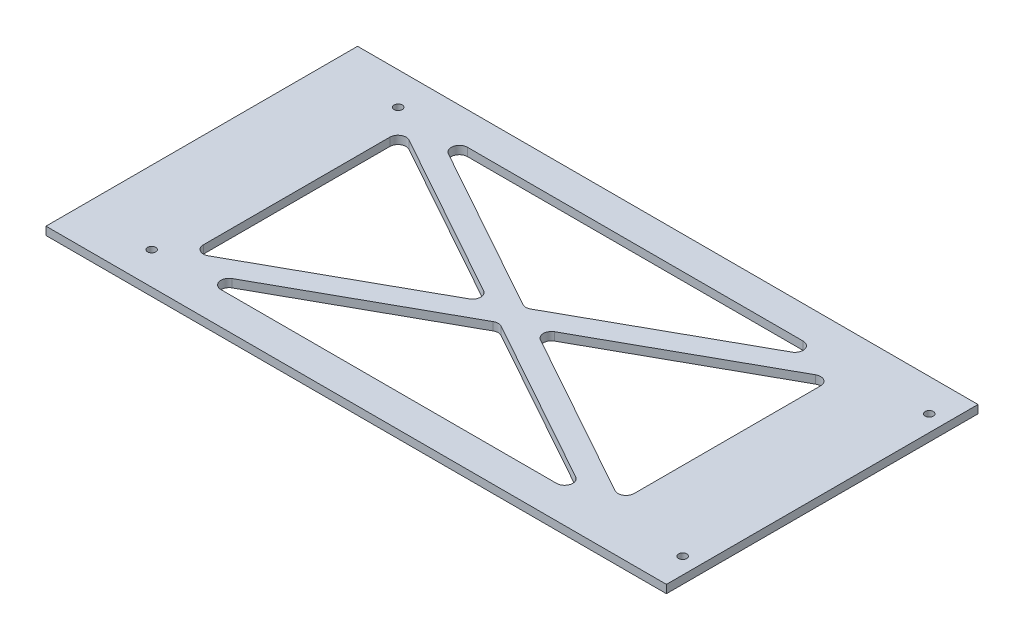
ISO-10303-21;
HEADER;
FILE_DESCRIPTION(('STEP AP214'),'2;1');
FILE_NAME('part.step','',(''),(''),'','','');
FILE_SCHEMA(('AUTOMOTIVE_DESIGN { 1 0 10303 214 1 1 1 1 }'));
ENDSEC;
DATA;
#1=APPLICATION_CONTEXT('core data for automotive mechanical design processes');
#2=APPLICATION_PROTOCOL_DEFINITION('international standard','automotive_design',2000,#1);
#3=PRODUCT_CONTEXT('',#1,'mechanical');
#4=PRODUCT('Part','Part','',(#3));
#5=PRODUCT_RELATED_PRODUCT_CATEGORY('part','',(#4));
#6=PRODUCT_DEFINITION_FORMATION('','',#4);
#7=PRODUCT_DEFINITION_CONTEXT('part definition',#1,'design');
#8=PRODUCT_DEFINITION('design','',#6,#7);
#9=PRODUCT_DEFINITION_SHAPE('','',#8);
#10=(LENGTH_UNIT() NAMED_UNIT(*) SI_UNIT(.MILLI.,.METRE.));
#11=(NAMED_UNIT(*) PLANE_ANGLE_UNIT() SI_UNIT($,.RADIAN.));
#12=(NAMED_UNIT(*) SI_UNIT($,.STERADIAN.) SOLID_ANGLE_UNIT());
#13=UNCERTAINTY_MEASURE_WITH_UNIT(LENGTH_MEASURE(1.E-05),#10,'distance_accuracy_value','');
#14=(GEOMETRIC_REPRESENTATION_CONTEXT(3) GLOBAL_UNCERTAINTY_ASSIGNED_CONTEXT((#13)) GLOBAL_UNIT_ASSIGNED_CONTEXT((#10,
#11,#12)) REPRESENTATION_CONTEXT('',''));
#15=CARTESIAN_POINT('',(0.,0.,0.));
#16=DIRECTION('',(0.,0.,1.));
#17=DIRECTION('',(1.,0.,0.));
#18=AXIS2_PLACEMENT_3D('',#15,#16,#17);
#19=CARTESIAN_POINT('',(0.,3.,0.));
#20=DIRECTION('',(0.,1.,0.));
#21=DIRECTION('',(0.,0.,1.));
#22=AXIS2_PLACEMENT_3D('',#19,#20,#21);
#23=PLANE('',#22);
#24=CARTESIAN_POINT('',(221.789756229659,3.,-23.3016412504768));
#25=DIRECTION('',(0.,1.,0.));
#26=DIRECTION('',(0.,0.,1.));
#27=AXIS2_PLACEMENT_3D('',#24,#25,#26);
#28=CIRCLE('',#27,1.50000000036683);
#29=CARTESIAN_POINT('',(221.789756229659,3.,-21.80164125011));
#30=VERTEX_POINT('',#29);
#31=EDGE_CURVE('E491',#30,#30,#28,.T.);
#32=ORIENTED_EDGE('',*,*,#31,.F.);
#33=EDGE_LOOP('',(#32));
#34=FACE_BOUND('',#33,.T.);
#35=CARTESIAN_POINT('',(25.7897562296587,3.,-23.3016412504768));
#36=DIRECTION('',(0.,1.,0.));
#37=DIRECTION('',(0.,0.,1.));
#38=AXIS2_PLACEMENT_3D('',#35,#36,#37);
#39=CIRCLE('',#38,1.50000000036683);
#40=CARTESIAN_POINT('',(25.7897562296587,3.,-21.80164125011));
#41=VERTEX_POINT('',#40);
#42=EDGE_CURVE('E507',#41,#41,#39,.T.);
#43=ORIENTED_EDGE('',*,*,#42,.F.);
#44=EDGE_LOOP('',(#43));
#45=FACE_BOUND('',#44,.T.);
#46=DIRECTION('',(0.,0.,1.));
#47=VECTOR('',#46,1.);
#48=CARTESIAN_POINT('',(-1.21024377034129,3.,-35.3016412504768));
#49=LINE('',#48,#47);
#50=CARTESIAN_POINT('',(-1.21024377034129,3.,-35.3016412504768));
#51=VERTEX_POINT('',#50);
#52=CARTESIAN_POINT('',(-1.21024377034129,3.,79.6983587495232));
#53=VERTEX_POINT('',#52);
#54=EDGE_CURVE('E515',#51,#53,#49,.T.);
#55=ORIENTED_EDGE('',*,*,#54,.T.);
#56=DIRECTION('',(1.,0.,0.));
#57=VECTOR('',#56,1.);
#58=CARTESIAN_POINT('',(-1.21024377034129,3.,79.6983587495232));
#59=LINE('',#58,#57);
#60=CARTESIAN_POINT('',(227.789756229659,3.,79.6983587495232));
#61=VERTEX_POINT('',#60);
#62=EDGE_CURVE('E519',#53,#61,#59,.T.);
#63=ORIENTED_EDGE('',*,*,#62,.T.);
#64=DIRECTION('',(0.,0.,-1.));
#65=VECTOR('',#64,1.);
#66=CARTESIAN_POINT('',(227.789756229659,3.,-35.3016412504768));
#67=LINE('',#66,#65);
#68=CARTESIAN_POINT('',(227.789756229659,3.,-35.3016412504768));
#69=VERTEX_POINT('',#68);
#70=EDGE_CURVE('E523',#61,#69,#67,.T.);
#71=ORIENTED_EDGE('',*,*,#70,.T.);
#72=DIRECTION('',(-1.,0.,0.));
#73=VECTOR('',#72,1.);
#74=CARTESIAN_POINT('',(-1.21024377034129,3.,-35.3016412504768));
#75=LINE('',#74,#73);
#76=EDGE_CURVE('E526',#69,#51,#75,.T.);
#77=ORIENTED_EDGE('',*,*,#76,.T.);
#78=EDGE_LOOP('',(#55,#63,#71,#77));
#79=FACE_BOUND('',#78,.T.);
#80=CARTESIAN_POINT('',(25.7897562296587,3.,67.6983587495232));
#81=DIRECTION('',(0.,1.,0.));
#82=DIRECTION('',(0.,0.,1.));
#83=AXIS2_PLACEMENT_3D('',#80,#81,#82);
#84=CIRCLE('',#83,1.50000000036683);
#85=CARTESIAN_POINT('',(25.7897562296587,3.,69.19835874989));
#86=VERTEX_POINT('',#85);
#87=EDGE_CURVE('E499',#86,#86,#84,.T.);
#88=ORIENTED_EDGE('',*,*,#87,.F.);
#89=EDGE_LOOP('',(#88));
#90=FACE_BOUND('',#89,.T.);
#91=CARTESIAN_POINT('',(221.789756229659,3.,67.6983587495232));
#92=DIRECTION('',(0.,1.,0.));
#93=DIRECTION('',(0.,0.,1.));
#94=AXIS2_PLACEMENT_3D('',#91,#92,#93);
#95=CIRCLE('',#94,1.50000000036683);
#96=CARTESIAN_POINT('',(221.789756229659,3.,69.19835874989));
#97=VERTEX_POINT('',#96);
#98=EDGE_CURVE('E483',#97,#97,#95,.T.);
#99=ORIENTED_EDGE('',*,*,#98,.F.);
#100=EDGE_LOOP('',(#99));
#101=FACE_BOUND('',#100,.T.);
#102=DIRECTION('',(0.,0.,1.));
#103=VECTOR('',#102,1.);
#104=CARTESIAN_POINT('',(33.7897562296587,3.,-12.2030978701478));
#105=LINE('',#104,#103);
#106=CARTESIAN_POINT('',(33.7897562296587,3.,-12.2030978701478));
#107=VERTEX_POINT('',#106);
#108=CARTESIAN_POINT('',(33.7897562296587,3.,56.5998153691941));
#109=VERTEX_POINT('',#108);
#110=EDGE_CURVE('E423',#107,#109,#105,.T.);
#111=ORIENTED_EDGE('',*,*,#110,.F.);
#112=CARTESIAN_POINT('',(36.7897562296587,3.,-12.2030978701478));
#113=DIRECTION('',(0.,1.,0.));
#114=DIRECTION('',(0.,0.,-1.));
#115=AXIS2_PLACEMENT_3D('',#112,#113,#114);
#116=CIRCLE('',#115,3.);
#117=CARTESIAN_POINT('',(38.2466850231946,3.,-14.8255696985124));
#118=VERTEX_POINT('',#117);
#119=EDGE_CURVE('E420',#118,#107,#116,.T.);
#120=ORIENTED_EDGE('',*,*,#119,.F.);
#121=DIRECTION('',(-0.874157276121538,0.,-0.485642931178632));
#122=VECTOR('',#121,1.);
#123=CARTESIAN_POINT('',(100.169306938602,3.,19.5758869211585));
#124=LINE('',#123,#122);
#125=CARTESIAN_POINT('',(100.169306938602,3.,19.5758869211585));
#126=VERTEX_POINT('',#125);
#127=EDGE_CURVE('E437',#126,#118,#124,.T.);
#128=ORIENTED_EDGE('',*,*,#127,.F.);
#129=CARTESIAN_POINT('',(98.7123781450665,3.,22.1983587495232));
#130=DIRECTION('',(0.,1.,0.));
#131=DIRECTION('',(0.,0.,1.));
#132=AXIS2_PLACEMENT_3D('',#129,#130,#131);
#133=CIRCLE('',#132,3.);
#134=CARTESIAN_POINT('',(100.169306938602,3.,24.8208305778878));
#135=VERTEX_POINT('',#134);
#136=EDGE_CURVE('E433',#135,#126,#133,.T.);
#137=ORIENTED_EDGE('',*,*,#136,.F.);
#138=DIRECTION('',(0.874157276121538,0.,-0.485642931178632));
#139=VECTOR('',#138,1.);
#140=CARTESIAN_POINT('',(38.2466850231946,3.,59.2222871975588));
#141=LINE('',#140,#139);
#142=CARTESIAN_POINT('',(38.2466850231946,3.,59.2222871975588));
#143=VERTEX_POINT('',#142);
#144=EDGE_CURVE('E430',#143,#135,#141,.T.);
#145=ORIENTED_EDGE('',*,*,#144,.F.);
#146=CARTESIAN_POINT('',(36.7897562296587,3.,56.5998153691942));
#147=DIRECTION('',(0.,1.,0.));
#148=DIRECTION('',(0.,0.,-1.));
#149=AXIS2_PLACEMENT_3D('',#146,#147,#148);
#150=CIRCLE('',#149,3.);
#151=EDGE_CURVE('E427',#109,#143,#150,.T.);
#152=ORIENTED_EDGE('',*,*,#151,.F.);
#153=EDGE_LOOP('',(#111,#120,#128,#137,#145,#152));
#154=FACE_BOUND('',#153,.T.);
#155=DIRECTION('',(-0.874157276121538,0.,0.485642931178632));
#156=VECTOR('',#155,1.);
#157=CARTESIAN_POINT('',(49.9102055207152,3.,62.0758869211585));
#158=LINE('',#157,#156);
#159=CARTESIAN_POINT('',(111.832827436123,3.,27.6744303014876));
#160=VERTEX_POINT('',#159);
#161=CARTESIAN_POINT('',(49.9102055207152,3.,62.0758869211585));
#162=VERTEX_POINT('',#161);
#163=EDGE_CURVE('E360',#160,#162,#158,.T.);
#164=ORIENTED_EDGE('',*,*,#163,.F.);
#165=CARTESIAN_POINT('',(113.289756229659,3.,30.2969021298522));
#166=DIRECTION('',(0.,1.,0.));
#167=DIRECTION('',(0.,0.,-1.));
#168=AXIS2_PLACEMENT_3D('',#165,#166,#167);
#169=CIRCLE('',#168,3.);
#170=CARTESIAN_POINT('',(114.746685023195,3.,27.6744303014876));
#171=VERTEX_POINT('',#170);
#172=EDGE_CURVE('E357',#171,#160,#169,.T.);
#173=ORIENTED_EDGE('',*,*,#172,.F.);
#174=DIRECTION('',(-0.874157276121538,0.,-0.485642931178632));
#175=VECTOR('',#174,1.);
#176=CARTESIAN_POINT('',(114.746685023195,3.,27.6744303014876));
#177=LINE('',#176,#175);
#178=CARTESIAN_POINT('',(176.669306938602,3.,62.0758869211585));
#179=VERTEX_POINT('',#178);
#180=EDGE_CURVE('E374',#179,#171,#177,.T.);
#181=ORIENTED_EDGE('',*,*,#180,.F.);
#182=CARTESIAN_POINT('',(175.212378145067,3.,64.6983587495232));
#183=DIRECTION('',(0.,1.,0.));
#184=DIRECTION('',(0.,0.,1.));
#185=AXIS2_PLACEMENT_3D('',#182,#183,#184);
#186=CIRCLE('',#185,3.);
#187=CARTESIAN_POINT('',(175.212378145066,3.,67.6983587495232));
#188=VERTEX_POINT('',#187);
#189=EDGE_CURVE('E370',#188,#179,#186,.T.);
#190=ORIENTED_EDGE('',*,*,#189,.F.);
#191=DIRECTION('',(1.,0.,0.));
#192=VECTOR('',#191,1.);
#193=CARTESIAN_POINT('',(175.212378145066,3.,67.6983587495232));
#194=LINE('',#193,#192);
#195=CARTESIAN_POINT('',(51.3671343142511,3.,67.6983587495232));
#196=VERTEX_POINT('',#195);
#197=EDGE_CURVE('E367',#196,#188,#194,.T.);
#198=ORIENTED_EDGE('',*,*,#197,.F.);
#199=CARTESIAN_POINT('',(51.3671343142509,3.,64.6983587495232));
#200=DIRECTION('',(0.,1.,0.));
#201=DIRECTION('',(0.,0.,-1.));
#202=AXIS2_PLACEMENT_3D('',#199,#200,#201);
#203=CIRCLE('',#202,3.);
#204=EDGE_CURVE('E364',#162,#196,#203,.T.);
#205=ORIENTED_EDGE('',*,*,#204,.F.);
#206=EDGE_LOOP('',(#164,#173,#181,#190,#198,#205));
#207=FACE_BOUND('',#206,.T.);
#208=DIRECTION('',(0.874157276121538,0.,0.485642931178632));
#209=VECTOR('',#208,1.);
#210=CARTESIAN_POINT('',(188.332827436123,3.,59.2222871975587));
#211=LINE('',#210,#209);
#212=CARTESIAN_POINT('',(126.410205520715,3.,24.8208305778878));
#213=VERTEX_POINT('',#212);
#214=CARTESIAN_POINT('',(188.332827436123,3.,59.2222871975587));
#215=VERTEX_POINT('',#214);
#216=EDGE_CURVE('E297',#213,#215,#211,.T.);
#217=ORIENTED_EDGE('',*,*,#216,.F.);
#218=CARTESIAN_POINT('',(127.867134314251,3.,22.1983587495232));
#219=DIRECTION('',(0.,1.,0.));
#220=DIRECTION('',(0.,0.,-1.));
#221=AXIS2_PLACEMENT_3D('',#218,#219,#220);
#222=CIRCLE('',#221,2.99999999999999);
#223=CARTESIAN_POINT('',(126.410205520715,3.,19.5758869211585));
#224=VERTEX_POINT('',#223);
#225=EDGE_CURVE('E294',#224,#213,#222,.T.);
#226=ORIENTED_EDGE('',*,*,#225,.F.);
#227=DIRECTION('',(-0.874157276121538,0.,0.485642931178632));
#228=VECTOR('',#227,1.);
#229=CARTESIAN_POINT('',(126.410205520715,3.,19.5758869211585));
#230=LINE('',#229,#228);
#231=CARTESIAN_POINT('',(188.332827436123,3.,-14.8255696985124));
#232=VERTEX_POINT('',#231);
#233=EDGE_CURVE('E311',#232,#224,#230,.T.);
#234=ORIENTED_EDGE('',*,*,#233,.F.);
#235=CARTESIAN_POINT('',(189.789756229659,3.,-12.2030978701478));
#236=DIRECTION('',(0.,1.,0.));
#237=DIRECTION('',(0.,0.,1.));
#238=AXIS2_PLACEMENT_3D('',#235,#236,#237);
#239=CIRCLE('',#238,3.);
#240=CARTESIAN_POINT('',(192.789756229659,3.,-12.2030978701478));
#241=VERTEX_POINT('',#240);
#242=EDGE_CURVE('E307',#241,#232,#239,.T.);
#243=ORIENTED_EDGE('',*,*,#242,.F.);
#244=DIRECTION('',(0.,0.,-1.));
#245=VECTOR('',#244,1.);
#246=CARTESIAN_POINT('',(192.789756229659,3.,-12.2030978701478));
#247=LINE('',#246,#245);
#248=CARTESIAN_POINT('',(192.789756229659,3.,56.5998153691941));
#249=VERTEX_POINT('',#248);
#250=EDGE_CURVE('E304',#249,#241,#247,.T.);
#251=ORIENTED_EDGE('',*,*,#250,.F.);
#252=CARTESIAN_POINT('',(189.789756229659,3.,56.5998153691942));
#253=DIRECTION('',(0.,1.,0.));
#254=DIRECTION('',(0.,0.,1.));
#255=AXIS2_PLACEMENT_3D('',#252,#253,#254);
#256=CIRCLE('',#255,3.);
#257=EDGE_CURVE('E301',#215,#249,#256,.T.);
#258=ORIENTED_EDGE('',*,*,#257,.F.);
#259=EDGE_LOOP('',(#217,#226,#234,#243,#251,#258));
#260=FACE_BOUND('',#259,.T.);
#261=DIRECTION('',(0.874157276121538,0.,-0.485642931178632));
#262=VECTOR('',#261,1.);
#263=CARTESIAN_POINT('',(114.746685023195,3.,16.7222871975588));
#264=LINE('',#263,#262);
#265=CARTESIAN_POINT('',(114.746685023195,3.,16.7222871975588));
#266=VERTEX_POINT('',#265);
#267=CARTESIAN_POINT('',(176.669306938602,3.,-17.6791694221121));
#268=VERTEX_POINT('',#267);
#269=EDGE_CURVE('E234',#266,#268,#264,.T.);
#270=ORIENTED_EDGE('',*,*,#269,.F.);
#271=CARTESIAN_POINT('',(113.289756229659,3.,14.0998153691942));
#272=DIRECTION('',(0.,1.,0.));
#273=DIRECTION('',(0.,0.,-1.));
#274=AXIS2_PLACEMENT_3D('',#271,#272,#273);
#275=CIRCLE('',#274,3.);
#276=CARTESIAN_POINT('',(111.832827436123,3.,16.7222871975588));
#277=VERTEX_POINT('',#276);
#278=EDGE_CURVE('E225',#277,#266,#275,.T.);
#279=ORIENTED_EDGE('',*,*,#278,.F.);
#280=DIRECTION('',(0.874157276121538,0.,0.485642931178632));
#281=VECTOR('',#280,1.);
#282=CARTESIAN_POINT('',(49.9102055207152,3.,-17.6791694221121));
#283=LINE('',#282,#281);
#284=CARTESIAN_POINT('',(49.9102055207152,3.,-17.6791694221121));
#285=VERTEX_POINT('',#284);
#286=EDGE_CURVE('E260',#285,#277,#283,.T.);
#287=ORIENTED_EDGE('',*,*,#286,.F.);
#288=CARTESIAN_POINT('',(51.3671343142509,3.,-20.3016412504768));
#289=DIRECTION('',(0.,1.,0.));
#290=DIRECTION('',(0.,0.,-1.));
#291=AXIS2_PLACEMENT_3D('',#288,#289,#290);
#292=CIRCLE('',#291,3.);
#293=CARTESIAN_POINT('',(51.3671343142511,3.,-23.3016412504768));
#294=VERTEX_POINT('',#293);
#295=EDGE_CURVE('E257',#294,#285,#292,.T.);
#296=ORIENTED_EDGE('',*,*,#295,.F.);
#297=DIRECTION('',(-1.,0.,0.));
#298=VECTOR('',#297,1.);
#299=CARTESIAN_POINT('',(175.212378145066,3.,-23.3016412504768));
#300=LINE('',#299,#298);
#301=CARTESIAN_POINT('',(175.212378145066,3.,-23.3016412504768));
#302=VERTEX_POINT('',#301);
#303=EDGE_CURVE('E252',#302,#294,#300,.T.);
#304=ORIENTED_EDGE('',*,*,#303,.F.);
#305=CARTESIAN_POINT('',(175.212378145067,3.,-20.3016412504768));
#306=DIRECTION('',(0.,1.,0.));
#307=DIRECTION('',(0.,0.,1.));
#308=AXIS2_PLACEMENT_3D('',#305,#306,#307);
#309=CIRCLE('',#308,3.);
#310=EDGE_CURVE('E248',#268,#302,#309,.T.);
#311=ORIENTED_EDGE('',*,*,#310,.F.);
#312=EDGE_LOOP('',(#270,#279,#287,#296,#304,#311));
#313=FACE_BOUND('',#312,.T.);
#314=ADVANCED_FACE('F39',(#34,#45,#79,#90,#101,#154,#207,#260,#313),#23,.T.);
#315=CARTESIAN_POINT('',(0.,0.,0.));
#316=DIRECTION('',(0.,1.,0.));
#317=DIRECTION('',(0.,0.,1.));
#318=AXIS2_PLACEMENT_3D('',#315,#316,#317);
#319=PLANE('',#318);
#320=CARTESIAN_POINT('',(127.867134314251,0.,22.1983587495232));
#321=DIRECTION('',(0.,1.,0.));
#322=DIRECTION('',(0.,0.,-1.));
#323=AXIS2_PLACEMENT_3D('',#320,#321,#322);
#324=CIRCLE('',#323,2.99999999999999);
#325=CARTESIAN_POINT('',(126.410205520715,0.,19.5758869211585));
#326=VERTEX_POINT('',#325);
#327=CARTESIAN_POINT('',(126.410205520715,0.,24.8208305778878));
#328=VERTEX_POINT('',#327);
#329=EDGE_CURVE('E243',#326,#328,#324,.T.);
#330=ORIENTED_EDGE('',*,*,#329,.T.);
#331=DIRECTION('',(0.874157276121538,0.,0.485642931178632));
#332=VECTOR('',#331,1.);
#333=CARTESIAN_POINT('',(188.332827436123,0.,59.2222871975587));
#334=LINE('',#333,#332);
#335=CARTESIAN_POINT('',(188.332827436123,0.,59.2222871975587));
#336=VERTEX_POINT('',#335);
#337=EDGE_CURVE('E318',#328,#336,#334,.T.);
#338=ORIENTED_EDGE('',*,*,#337,.T.);
#339=CARTESIAN_POINT('',(189.789756229659,0.,56.5998153691942));
#340=DIRECTION('',(0.,1.,0.));
#341=DIRECTION('',(0.,0.,1.));
#342=AXIS2_PLACEMENT_3D('',#339,#340,#341);
#343=CIRCLE('',#342,3.);
#344=CARTESIAN_POINT('',(192.789756229659,0.,56.5998153691941));
#345=VERTEX_POINT('',#344);
#346=EDGE_CURVE('E322',#336,#345,#343,.T.);
#347=ORIENTED_EDGE('',*,*,#346,.T.);
#348=DIRECTION('',(0.,0.,-1.));
#349=VECTOR('',#348,1.);
#350=CARTESIAN_POINT('',(192.789756229659,0.,-12.2030978701478));
#351=LINE('',#350,#349);
#352=CARTESIAN_POINT('',(192.789756229659,0.,-12.2030978701478));
#353=VERTEX_POINT('',#352);
#354=EDGE_CURVE('E326',#345,#353,#351,.T.);
#355=ORIENTED_EDGE('',*,*,#354,.T.);
#356=CARTESIAN_POINT('',(189.789756229659,0.,-12.2030978701478));
#357=DIRECTION('',(0.,1.,0.));
#358=DIRECTION('',(0.,0.,1.));
#359=AXIS2_PLACEMENT_3D('',#356,#357,#358);
#360=CIRCLE('',#359,3.);
#361=CARTESIAN_POINT('',(188.332827436123,0.,-14.8255696985124));
#362=VERTEX_POINT('',#361);
#363=EDGE_CURVE('E330',#353,#362,#360,.T.);
#364=ORIENTED_EDGE('',*,*,#363,.T.);
#365=DIRECTION('',(-0.874157276121538,0.,0.485642931178632));
#366=VECTOR('',#365,1.);
#367=CARTESIAN_POINT('',(126.410205520715,0.,19.5758869211585));
#368=LINE('',#367,#366);
#369=EDGE_CURVE('E298',#362,#326,#368,.T.);
#370=ORIENTED_EDGE('',*,*,#369,.T.);
#371=EDGE_LOOP('',(#330,#338,#347,#355,#364,#370));
#372=FACE_BOUND('',#371,.T.);
#373=CARTESIAN_POINT('',(36.7897562296587,0.,-12.2030978701478));
#374=DIRECTION('',(0.,1.,0.));
#375=DIRECTION('',(0.,0.,-1.));
#376=AXIS2_PLACEMENT_3D('',#373,#374,#375);
#377=CIRCLE('',#376,3.);
#378=CARTESIAN_POINT('',(38.2466850231946,0.,-14.8255696985124));
#379=VERTEX_POINT('',#378);
#380=CARTESIAN_POINT('',(33.7897562296587,0.,-12.2030978701478));
#381=VERTEX_POINT('',#380);
#382=EDGE_CURVE('E419',#379,#381,#377,.T.);
#383=ORIENTED_EDGE('',*,*,#382,.T.);
#384=DIRECTION('',(0.,0.,1.));
#385=VECTOR('',#384,1.);
#386=CARTESIAN_POINT('',(33.7897562296587,0.,-12.2030978701478));
#387=LINE('',#386,#385);
#388=CARTESIAN_POINT('',(33.7897562296587,0.,56.5998153691941));
#389=VERTEX_POINT('',#388);
#390=EDGE_CURVE('E444',#381,#389,#387,.T.);
#391=ORIENTED_EDGE('',*,*,#390,.T.);
#392=CARTESIAN_POINT('',(36.7897562296587,0.,56.5998153691942));
#393=DIRECTION('',(0.,1.,0.));
#394=DIRECTION('',(0.,0.,-1.));
#395=AXIS2_PLACEMENT_3D('',#392,#393,#394);
#396=CIRCLE('',#395,3.);
#397=CARTESIAN_POINT('',(38.2466850231946,0.,59.2222871975588));
#398=VERTEX_POINT('',#397);
#399=EDGE_CURVE('E448',#389,#398,#396,.T.);
#400=ORIENTED_EDGE('',*,*,#399,.T.);
#401=DIRECTION('',(0.874157276121538,0.,-0.485642931178632));
#402=VECTOR('',#401,1.);
#403=CARTESIAN_POINT('',(38.2466850231946,0.,59.2222871975588));
#404=LINE('',#403,#402);
#405=CARTESIAN_POINT('',(100.169306938602,0.,24.8208305778878));
#406=VERTEX_POINT('',#405);
#407=EDGE_CURVE('E452',#398,#406,#404,.T.);
#408=ORIENTED_EDGE('',*,*,#407,.T.);
#409=CARTESIAN_POINT('',(98.7123781450665,0.,22.1983587495232));
#410=DIRECTION('',(0.,1.,0.));
#411=DIRECTION('',(0.,0.,1.));
#412=AXIS2_PLACEMENT_3D('',#409,#410,#411);
#413=CIRCLE('',#412,3.);
#414=CARTESIAN_POINT('',(100.169306938602,0.,19.5758869211585));
#415=VERTEX_POINT('',#414);
#416=EDGE_CURVE('E456',#406,#415,#413,.T.);
#417=ORIENTED_EDGE('',*,*,#416,.T.);
#418=DIRECTION('',(-0.874157276121538,0.,-0.485642931178632));
#419=VECTOR('',#418,1.);
#420=CARTESIAN_POINT('',(100.169306938602,0.,19.5758869211585));
#421=LINE('',#420,#419);
#422=EDGE_CURVE('E424',#415,#379,#421,.T.);
#423=ORIENTED_EDGE('',*,*,#422,.T.);
#424=EDGE_LOOP('',(#383,#391,#400,#408,#417,#423));
#425=FACE_BOUND('',#424,.T.);
#426=DIRECTION('',(0.,0.,1.));
#427=VECTOR('',#426,1.);
#428=CARTESIAN_POINT('',(-1.21024377034129,0.,-35.3016412504768));
#429=LINE('',#428,#427);
#430=CARTESIAN_POINT('',(-1.21024377034129,0.,-35.3016412504768));
#431=VERTEX_POINT('',#430);
#432=CARTESIAN_POINT('',(-1.21024377034129,0.,79.6983587495232));
#433=VERTEX_POINT('',#432);
#434=EDGE_CURVE('E511',#431,#433,#429,.T.);
#435=ORIENTED_EDGE('',*,*,#434,.F.);
#436=DIRECTION('',(-1.,0.,0.));
#437=VECTOR('',#436,1.);
#438=CARTESIAN_POINT('',(-1.21024377034129,0.,-35.3016412504768));
#439=LINE('',#438,#437);
#440=CARTESIAN_POINT('',(227.789756229659,0.,-35.3016412504768));
#441=VERTEX_POINT('',#440);
#442=EDGE_CURVE('E520',#441,#431,#439,.T.);
#443=ORIENTED_EDGE('',*,*,#442,.F.);
#444=DIRECTION('',(0.,0.,-1.));
#445=VECTOR('',#444,1.);
#446=CARTESIAN_POINT('',(227.789756229659,0.,-35.3016412504768));
#447=LINE('',#446,#445);
#448=CARTESIAN_POINT('',(227.789756229659,0.,79.6983587495232));
#449=VERTEX_POINT('',#448);
#450=EDGE_CURVE('E536',#449,#441,#447,.T.);
#451=ORIENTED_EDGE('',*,*,#450,.F.);
#452=DIRECTION('',(1.,0.,0.));
#453=VECTOR('',#452,1.);
#454=CARTESIAN_POINT('',(-1.21024377034129,0.,79.6983587495232));
#455=LINE('',#454,#453);
#456=EDGE_CURVE('E533',#433,#449,#455,.T.);
#457=ORIENTED_EDGE('',*,*,#456,.F.);
#458=EDGE_LOOP('',(#435,#443,#451,#457));
#459=FACE_BOUND('',#458,.T.);
#460=CARTESIAN_POINT('',(25.7897562296587,0.,-23.3016412504768));
#461=DIRECTION('',(0.,1.,0.));
#462=DIRECTION('',(0.,0.,1.));
#463=AXIS2_PLACEMENT_3D('',#460,#461,#462);
#464=CIRCLE('',#463,1.50000000036683);
#465=CARTESIAN_POINT('',(25.7897562296587,0.,-21.80164125011));
#466=VERTEX_POINT('',#465);
#467=EDGE_CURVE('E503',#466,#466,#464,.T.);
#468=ORIENTED_EDGE('',*,*,#467,.T.);
#469=EDGE_LOOP('',(#468));
#470=FACE_BOUND('',#469,.T.);
#471=CARTESIAN_POINT('',(25.7897562296587,0.,67.6983587495232));
#472=DIRECTION('',(0.,1.,0.));
#473=DIRECTION('',(0.,0.,1.));
#474=AXIS2_PLACEMENT_3D('',#471,#472,#473);
#475=CIRCLE('',#474,1.50000000036683);
#476=CARTESIAN_POINT('',(25.7897562296587,0.,69.19835874989));
#477=VERTEX_POINT('',#476);
#478=EDGE_CURVE('E495',#477,#477,#475,.T.);
#479=ORIENTED_EDGE('',*,*,#478,.T.);
#480=EDGE_LOOP('',(#479));
#481=FACE_BOUND('',#480,.T.);
#482=CARTESIAN_POINT('',(221.789756229659,0.,-23.3016412504768));
#483=DIRECTION('',(0.,1.,0.));
#484=DIRECTION('',(0.,0.,1.));
#485=AXIS2_PLACEMENT_3D('',#482,#483,#484);
#486=CIRCLE('',#485,1.50000000036683);
#487=CARTESIAN_POINT('',(221.789756229659,0.,-21.80164125011));
#488=VERTEX_POINT('',#487);
#489=EDGE_CURVE('E487',#488,#488,#486,.T.);
#490=ORIENTED_EDGE('',*,*,#489,.T.);
#491=EDGE_LOOP('',(#490));
#492=FACE_BOUND('',#491,.T.);
#493=CARTESIAN_POINT('',(221.789756229659,0.,67.6983587495232));
#494=DIRECTION('',(0.,1.,0.));
#495=DIRECTION('',(0.,0.,1.));
#496=AXIS2_PLACEMENT_3D('',#493,#494,#495);
#497=CIRCLE('',#496,1.50000000036683);
#498=CARTESIAN_POINT('',(221.789756229659,0.,69.19835874989));
#499=VERTEX_POINT('',#498);
#500=EDGE_CURVE('E482',#499,#499,#497,.T.);
#501=ORIENTED_EDGE('',*,*,#500,.T.);
#502=EDGE_LOOP('',(#501));
#503=FACE_BOUND('',#502,.T.);
#504=CARTESIAN_POINT('',(113.289756229659,0.,30.2969021298522));
#505=DIRECTION('',(0.,1.,0.));
#506=DIRECTION('',(0.,0.,-1.));
#507=AXIS2_PLACEMENT_3D('',#504,#505,#506);
#508=CIRCLE('',#507,3.);
#509=CARTESIAN_POINT('',(114.746685023195,0.,27.6744303014876));
#510=VERTEX_POINT('',#509);
#511=CARTESIAN_POINT('',(111.832827436123,0.,27.6744303014876));
#512=VERTEX_POINT('',#511);
#513=EDGE_CURVE('E356',#510,#512,#508,.T.);
#514=ORIENTED_EDGE('',*,*,#513,.T.);
#515=DIRECTION('',(-0.874157276121538,0.,0.485642931178632));
#516=VECTOR('',#515,1.);
#517=CARTESIAN_POINT('',(49.9102055207152,0.,62.0758869211585));
#518=LINE('',#517,#516);
#519=CARTESIAN_POINT('',(49.9102055207152,0.,62.0758869211585));
#520=VERTEX_POINT('',#519);
#521=EDGE_CURVE('E381',#512,#520,#518,.T.);
#522=ORIENTED_EDGE('',*,*,#521,.T.);
#523=CARTESIAN_POINT('',(51.3671343142509,0.,64.6983587495232));
#524=DIRECTION('',(0.,1.,0.));
#525=DIRECTION('',(0.,0.,-1.));
#526=AXIS2_PLACEMENT_3D('',#523,#524,#525);
#527=CIRCLE('',#526,3.);
#528=CARTESIAN_POINT('',(51.3671343142511,0.,67.6983587495232));
#529=VERTEX_POINT('',#528);
#530=EDGE_CURVE('E385',#520,#529,#527,.T.);
#531=ORIENTED_EDGE('',*,*,#530,.T.);
#532=DIRECTION('',(1.,0.,0.));
#533=VECTOR('',#532,1.);
#534=CARTESIAN_POINT('',(175.212378145066,0.,67.6983587495232));
#535=LINE('',#534,#533);
#536=CARTESIAN_POINT('',(175.212378145066,0.,67.6983587495232));
#537=VERTEX_POINT('',#536);
#538=EDGE_CURVE('E389',#529,#537,#535,.T.);
#539=ORIENTED_EDGE('',*,*,#538,.T.);
#540=CARTESIAN_POINT('',(175.212378145067,0.,64.6983587495232));
#541=DIRECTION('',(0.,1.,0.));
#542=DIRECTION('',(0.,0.,1.));
#543=AXIS2_PLACEMENT_3D('',#540,#541,#542);
#544=CIRCLE('',#543,3.);
#545=CARTESIAN_POINT('',(176.669306938602,0.,62.0758869211585));
#546=VERTEX_POINT('',#545);
#547=EDGE_CURVE('E393',#537,#546,#544,.T.);
#548=ORIENTED_EDGE('',*,*,#547,.T.);
#549=DIRECTION('',(-0.874157276121538,0.,-0.485642931178632));
#550=VECTOR('',#549,1.);
#551=CARTESIAN_POINT('',(114.746685023195,0.,27.6744303014876));
#552=LINE('',#551,#550);
#553=EDGE_CURVE('E361',#546,#510,#552,.T.);
#554=ORIENTED_EDGE('',*,*,#553,.T.);
#555=EDGE_LOOP('',(#514,#522,#531,#539,#548,#554));
#556=FACE_BOUND('',#555,.T.);
#557=CARTESIAN_POINT('',(113.289756229659,0.,14.0998153691942));
#558=DIRECTION('',(0.,1.,0.));
#559=DIRECTION('',(0.,0.,-1.));
#560=AXIS2_PLACEMENT_3D('',#557,#558,#559);
#561=CIRCLE('',#560,3.);
#562=CARTESIAN_POINT('',(111.832827436123,0.,16.7222871975588));
#563=VERTEX_POINT('',#562);
#564=CARTESIAN_POINT('',(114.746685023195,0.,16.7222871975588));
#565=VERTEX_POINT('',#564);
#566=EDGE_CURVE('E63',#563,#565,#561,.T.);
#567=ORIENTED_EDGE('',*,*,#566,.T.);
#568=DIRECTION('',(0.874157276121538,0.,-0.485642931178632));
#569=VECTOR('',#568,1.);
#570=CARTESIAN_POINT('',(114.746685023195,0.,16.7222871975588));
#571=LINE('',#570,#569);
#572=CARTESIAN_POINT('',(176.669306938602,0.,-17.6791694221121));
#573=VERTEX_POINT('',#572);
#574=EDGE_CURVE('E241',#565,#573,#571,.T.);
#575=ORIENTED_EDGE('',*,*,#574,.T.);
#576=CARTESIAN_POINT('',(175.212378145067,0.,-20.3016412504768));
#577=DIRECTION('',(0.,1.,0.));
#578=DIRECTION('',(0.,0.,1.));
#579=AXIS2_PLACEMENT_3D('',#576,#577,#578);
#580=CIRCLE('',#579,3.);
#581=CARTESIAN_POINT('',(175.212378145066,0.,-23.3016412504768));
#582=VERTEX_POINT('',#581);
#583=EDGE_CURVE('E267',#573,#582,#580,.T.);
#584=ORIENTED_EDGE('',*,*,#583,.T.);
#585=DIRECTION('',(-1.,0.,0.));
#586=VECTOR('',#585,1.);
#587=CARTESIAN_POINT('',(175.212378145066,0.,-23.3016412504768));
#588=LINE('',#587,#586);
#589=CARTESIAN_POINT('',(51.3671343142511,0.,-23.3016412504768));
#590=VERTEX_POINT('',#589);
#591=EDGE_CURVE('E271',#582,#590,#588,.T.);
#592=ORIENTED_EDGE('',*,*,#591,.T.);
#593=CARTESIAN_POINT('',(51.3671343142509,0.,-20.3016412504768));
#594=DIRECTION('',(0.,1.,0.));
#595=DIRECTION('',(0.,0.,-1.));
#596=AXIS2_PLACEMENT_3D('',#593,#594,#595);
#597=CIRCLE('',#596,3.);
#598=CARTESIAN_POINT('',(49.9102055207152,0.,-17.6791694221121));
#599=VERTEX_POINT('',#598);
#600=EDGE_CURVE('E275',#590,#599,#597,.T.);
#601=ORIENTED_EDGE('',*,*,#600,.T.);
#602=DIRECTION('',(0.874157276121538,0.,0.485642931178632));
#603=VECTOR('',#602,1.);
#604=CARTESIAN_POINT('',(49.9102055207152,0.,-17.6791694221121));
#605=LINE('',#604,#603);
#606=EDGE_CURVE('E235',#599,#563,#605,.T.);
#607=ORIENTED_EDGE('',*,*,#606,.T.);
#608=EDGE_LOOP('',(#567,#575,#584,#592,#601,#607));
#609=FACE_BOUND('',#608,.T.);
#610=ADVANCED_FACE('F559',(#372,#425,#459,#470,#481,#492,#503,#556,#609),#319,.F.);
#611=CARTESIAN_POINT('',(-1.21024377034129,3.,-35.3016412504768));
#612=DIRECTION('',(1.,0.,0.));
#613=DIRECTION('',(0.,0.,-1.));
#614=AXIS2_PLACEMENT_3D('',#611,#612,#613);
#615=PLANE('',#614);
#616=ORIENTED_EDGE('',*,*,#434,.T.);
#617=DIRECTION('',(0.,-1.,0.));
#618=VECTOR('',#617,1.);
#619=CARTESIAN_POINT('',(-1.21024377034129,3.,79.6983587495232));
#620=LINE('',#619,#618);
#621=EDGE_CURVE('E11',#53,#433,#620,.T.);
#622=ORIENTED_EDGE('',*,*,#621,.F.);
#623=ORIENTED_EDGE('',*,*,#54,.F.);
#624=DIRECTION('',(0.,-1.,0.));
#625=VECTOR('',#624,1.);
#626=CARTESIAN_POINT('',(-1.21024377034129,3.,-35.3016412504768));
#627=LINE('',#626,#625);
#628=EDGE_CURVE('E529',#51,#431,#627,.T.);
#629=ORIENTED_EDGE('',*,*,#628,.T.);
#630=EDGE_LOOP('',(#616,#622,#623,#629));
#631=FACE_BOUND('',#630,.T.);
#632=ADVANCED_FACE('F41',(#631),#615,.F.);
#633=CARTESIAN_POINT('',(-1.21024377034129,3.,79.6983587495232));
#634=DIRECTION('',(0.,0.,-1.));
#635=DIRECTION('',(-1.,0.,0.));
#636=AXIS2_PLACEMENT_3D('',#633,#634,#635);
#637=PLANE('',#636);
#638=ORIENTED_EDGE('',*,*,#456,.T.);
#639=DIRECTION('',(0.,-1.,0.));
#640=VECTOR('',#639,1.);
#641=CARTESIAN_POINT('',(227.789756229659,3.,79.6983587495232));
#642=LINE('',#641,#640);
#643=EDGE_CURVE('E48',#61,#449,#642,.T.);
#644=ORIENTED_EDGE('',*,*,#643,.F.);
#645=ORIENTED_EDGE('',*,*,#62,.F.);
#646=ORIENTED_EDGE('',*,*,#621,.T.);
#647=EDGE_LOOP('',(#638,#644,#645,#646));
#648=FACE_BOUND('',#647,.T.);
#649=ADVANCED_FACE('F570',(#648),#637,.F.);
#650=CARTESIAN_POINT('',(227.789756229659,3.,-35.3016412504768));
#651=DIRECTION('',(-1.,0.,0.));
#652=DIRECTION('',(0.,0.,1.));
#653=AXIS2_PLACEMENT_3D('',#650,#651,#652);
#654=PLANE('',#653);
#655=ORIENTED_EDGE('',*,*,#450,.T.);
#656=DIRECTION('',(0.,-1.,0.));
#657=VECTOR('',#656,1.);
#658=CARTESIAN_POINT('',(227.789756229659,3.,-35.3016412504768));
#659=LINE('',#658,#657);
#660=EDGE_CURVE('E544',#69,#441,#659,.T.);
#661=ORIENTED_EDGE('',*,*,#660,.F.);
#662=ORIENTED_EDGE('',*,*,#70,.F.);
#663=ORIENTED_EDGE('',*,*,#643,.T.);
#664=EDGE_LOOP('',(#655,#661,#662,#663));
#665=FACE_BOUND('',#664,.T.);
#666=ADVANCED_FACE('F553',(#665),#654,.F.);
#667=CARTESIAN_POINT('',(-1.21024377034129,3.,-35.3016412504768));
#668=DIRECTION('',(0.,0.,1.));
#669=DIRECTION('',(1.,0.,0.));
#670=AXIS2_PLACEMENT_3D('',#667,#668,#669);
#671=PLANE('',#670);
#672=ORIENTED_EDGE('',*,*,#442,.T.);
#673=ORIENTED_EDGE('',*,*,#628,.F.);
#674=ORIENTED_EDGE('',*,*,#76,.F.);
#675=ORIENTED_EDGE('',*,*,#660,.T.);
#676=EDGE_LOOP('',(#672,#673,#674,#675));
#677=FACE_BOUND('',#676,.T.);
#678=ADVANCED_FACE('F563',(#677),#671,.F.);
#679=CARTESIAN_POINT('',(25.7897562296587,3.,-23.3016412504768));
#680=DIRECTION('',(0.,-1.,0.));
#681=DIRECTION('',(0.,0.,-1.));
#682=AXIS2_PLACEMENT_3D('',#679,#680,#681);
#683=CYLINDRICAL_SURFACE('',#682,1.50000000036683);
#684=ORIENTED_EDGE('',*,*,#42,.T.);
#685=EDGE_LOOP('',(#684));
#686=FACE_BOUND('',#685,.T.);
#687=ORIENTED_EDGE('',*,*,#467,.F.);
#688=EDGE_LOOP('',(#687));
#689=FACE_BOUND('',#688,.T.);
#690=ADVANCED_FACE('F588',(#686,#689),#683,.F.);
#691=CARTESIAN_POINT('',(25.7897562296587,3.,67.6983587495232));
#692=DIRECTION('',(0.,-1.,0.));
#693=DIRECTION('',(0.,0.,-1.));
#694=AXIS2_PLACEMENT_3D('',#691,#692,#693);
#695=CYLINDRICAL_SURFACE('',#694,1.50000000036683);
#696=ORIENTED_EDGE('',*,*,#87,.T.);
#697=EDGE_LOOP('',(#696));
#698=FACE_BOUND('',#697,.T.);
#699=ORIENTED_EDGE('',*,*,#478,.F.);
#700=EDGE_LOOP('',(#699));
#701=FACE_BOUND('',#700,.T.);
#702=ADVANCED_FACE('F595',(#698,#701),#695,.F.);
#703=CARTESIAN_POINT('',(221.789756229659,3.,-23.3016412504768));
#704=DIRECTION('',(0.,-1.,0.));
#705=DIRECTION('',(0.,0.,-1.));
#706=AXIS2_PLACEMENT_3D('',#703,#704,#705);
#707=CYLINDRICAL_SURFACE('',#706,1.50000000036683);
#708=ORIENTED_EDGE('',*,*,#31,.T.);
#709=EDGE_LOOP('',(#708));
#710=FACE_BOUND('',#709,.T.);
#711=ORIENTED_EDGE('',*,*,#489,.F.);
#712=EDGE_LOOP('',(#711));
#713=FACE_BOUND('',#712,.T.);
#714=ADVANCED_FACE('F600',(#710,#713),#707,.F.);
#715=CARTESIAN_POINT('',(221.789756229659,3.,67.6983587495232));
#716=DIRECTION('',(0.,-1.,0.));
#717=DIRECTION('',(0.,0.,-1.));
#718=AXIS2_PLACEMENT_3D('',#715,#716,#717);
#719=CYLINDRICAL_SURFACE('',#718,1.50000000036683);
#720=ORIENTED_EDGE('',*,*,#98,.T.);
#721=EDGE_LOOP('',(#720));
#722=FACE_BOUND('',#721,.T.);
#723=ORIENTED_EDGE('',*,*,#500,.F.);
#724=EDGE_LOOP('',(#723));
#725=FACE_BOUND('',#724,.T.);
#726=ADVANCED_FACE('F709',(#722,#725),#719,.F.);
#727=CARTESIAN_POINT('',(36.7897562296587,3.,-12.2030978701478));
#728=DIRECTION('',(0.,-1.,0.));
#729=DIRECTION('',(0.,0.,-1.));
#730=AXIS2_PLACEMENT_3D('',#727,#728,#729);
#731=CYLINDRICAL_SURFACE('',#730,3.);
#732=ORIENTED_EDGE('',*,*,#382,.F.);
#733=DIRECTION('',(0.,-1.,0.));
#734=VECTOR('',#733,1.);
#735=CARTESIAN_POINT('',(38.2466850231946,3.,-14.8255696985124));
#736=LINE('',#735,#734);
#737=EDGE_CURVE('E440',#118,#379,#736,.T.);
#738=ORIENTED_EDGE('',*,*,#737,.F.);
#739=ORIENTED_EDGE('',*,*,#119,.T.);
#740=DIRECTION('',(0.,-1.,0.));
#741=VECTOR('',#740,1.);
#742=CARTESIAN_POINT('',(33.7897562296587,3.,-12.2030978701478));
#743=LINE('',#742,#741);
#744=EDGE_CURVE('E478',#107,#381,#743,.T.);
#745=ORIENTED_EDGE('',*,*,#744,.T.);
#746=EDGE_LOOP('',(#732,#738,#739,#745));
#747=FACE_BOUND('',#746,.T.);
#748=ADVANCED_FACE('F705',(#747),#731,.F.);
#749=CARTESIAN_POINT('',(33.7897562296587,3.,-12.2030978701478));
#750=DIRECTION('',(1.,0.,0.));
#751=DIRECTION('',(0.,0.,-1.));
#752=AXIS2_PLACEMENT_3D('',#749,#750,#751);
#753=PLANE('',#752);
#754=ORIENTED_EDGE('',*,*,#390,.F.);
#755=ORIENTED_EDGE('',*,*,#744,.F.);
#756=ORIENTED_EDGE('',*,*,#110,.T.);
#757=DIRECTION('',(0.,-1.,0.));
#758=VECTOR('',#757,1.);
#759=CARTESIAN_POINT('',(33.7897562296587,3.,56.5998153691941));
#760=LINE('',#759,#758);
#761=EDGE_CURVE('E475',#109,#389,#760,.T.);
#762=ORIENTED_EDGE('',*,*,#761,.T.);
#763=EDGE_LOOP('',(#754,#755,#756,#762));
#764=FACE_BOUND('',#763,.T.);
#765=ADVANCED_FACE('F701',(#764),#753,.T.);
#766=CARTESIAN_POINT('',(36.7897562296587,3.,56.5998153691942));
#767=DIRECTION('',(0.,-1.,0.));
#768=DIRECTION('',(0.,0.,-1.));
#769=AXIS2_PLACEMENT_3D('',#766,#767,#768);
#770=CYLINDRICAL_SURFACE('',#769,3.);
#771=ORIENTED_EDGE('',*,*,#399,.F.);
#772=ORIENTED_EDGE('',*,*,#761,.F.);
#773=ORIENTED_EDGE('',*,*,#151,.T.);
#774=DIRECTION('',(0.,-1.,0.));
#775=VECTOR('',#774,1.);
#776=CARTESIAN_POINT('',(38.2466850231946,3.,59.2222871975588));
#777=LINE('',#776,#775);
#778=EDGE_CURVE('E472',#143,#398,#777,.T.);
#779=ORIENTED_EDGE('',*,*,#778,.T.);
#780=EDGE_LOOP('',(#771,#772,#773,#779));
#781=FACE_BOUND('',#780,.T.);
#782=ADVANCED_FACE('F697',(#781),#770,.F.);
#783=CARTESIAN_POINT('',(38.2466850231946,3.,59.2222871975588));
#784=DIRECTION('',(-0.485642931178632,0.,-0.874157276121538));
#785=DIRECTION('',(-0.874157276121538,0.,0.485642931178632));
#786=AXIS2_PLACEMENT_3D('',#783,#784,#785);
#787=PLANE('',#786);
#788=ORIENTED_EDGE('',*,*,#407,.F.);
#789=ORIENTED_EDGE('',*,*,#778,.F.);
#790=ORIENTED_EDGE('',*,*,#144,.T.);
#791=DIRECTION('',(0.,-1.,0.));
#792=VECTOR('',#791,1.);
#793=CARTESIAN_POINT('',(100.169306938602,3.,24.8208305778878));
#794=LINE('',#793,#792);
#795=EDGE_CURVE('E469',#135,#406,#794,.T.);
#796=ORIENTED_EDGE('',*,*,#795,.T.);
#797=EDGE_LOOP('',(#788,#789,#790,#796));
#798=FACE_BOUND('',#797,.T.);
#799=ADVANCED_FACE('F693',(#798),#787,.T.);
#800=CARTESIAN_POINT('',(98.7123781450665,3.,22.1983587495232));
#801=DIRECTION('',(0.,-1.,0.));
#802=DIRECTION('',(0.,0.,-1.));
#803=AXIS2_PLACEMENT_3D('',#800,#801,#802);
#804=CYLINDRICAL_SURFACE('',#803,3.);
#805=ORIENTED_EDGE('',*,*,#416,.F.);
#806=ORIENTED_EDGE('',*,*,#795,.F.);
#807=ORIENTED_EDGE('',*,*,#136,.T.);
#808=DIRECTION('',(0.,-1.,0.));
#809=VECTOR('',#808,1.);
#810=CARTESIAN_POINT('',(100.169306938602,3.,19.5758869211585));
#811=LINE('',#810,#809);
#812=EDGE_CURVE('E466',#126,#415,#811,.T.);
#813=ORIENTED_EDGE('',*,*,#812,.T.);
#814=EDGE_LOOP('',(#805,#806,#807,#813));
#815=FACE_BOUND('',#814,.T.);
#816=ADVANCED_FACE('F689',(#815),#804,.F.);
#817=CARTESIAN_POINT('',(100.169306938602,3.,19.5758869211585));
#818=DIRECTION('',(-0.485642931178632,0.,0.874157276121538));
#819=DIRECTION('',(0.874157276121538,0.,0.485642931178632));
#820=AXIS2_PLACEMENT_3D('',#817,#818,#819);
#821=PLANE('',#820);
#822=ORIENTED_EDGE('',*,*,#422,.F.);
#823=ORIENTED_EDGE('',*,*,#812,.F.);
#824=ORIENTED_EDGE('',*,*,#127,.T.);
#825=ORIENTED_EDGE('',*,*,#737,.T.);
#826=EDGE_LOOP('',(#822,#823,#824,#825));
#827=FACE_BOUND('',#826,.T.);
#828=ADVANCED_FACE('F685',(#827),#821,.T.);
#829=CARTESIAN_POINT('',(113.289756229659,3.,30.2969021298522));
#830=DIRECTION('',(0.,-1.,0.));
#831=DIRECTION('',(0.,0.,-1.));
#832=AXIS2_PLACEMENT_3D('',#829,#830,#831);
#833=CYLINDRICAL_SURFACE('',#832,3.);
#834=ORIENTED_EDGE('',*,*,#513,.F.);
#835=DIRECTION('',(0.,-1.,0.));
#836=VECTOR('',#835,1.);
#837=CARTESIAN_POINT('',(114.746685023195,3.,27.6744303014876));
#838=LINE('',#837,#836);
#839=EDGE_CURVE('E377',#171,#510,#838,.T.);
#840=ORIENTED_EDGE('',*,*,#839,.F.);
#841=ORIENTED_EDGE('',*,*,#172,.T.);
#842=DIRECTION('',(0.,-1.,0.));
#843=VECTOR('',#842,1.);
#844=CARTESIAN_POINT('',(111.832827436123,3.,27.6744303014876));
#845=LINE('',#844,#843);
#846=EDGE_CURVE('E415',#160,#512,#845,.T.);
#847=ORIENTED_EDGE('',*,*,#846,.T.);
#848=EDGE_LOOP('',(#834,#840,#841,#847));
#849=FACE_BOUND('',#848,.T.);
#850=ADVANCED_FACE('F681',(#849),#833,.F.);
#851=CARTESIAN_POINT('',(49.9102055207152,3.,62.0758869211585));
#852=DIRECTION('',(0.485642931178632,0.,0.874157276121538));
#853=DIRECTION('',(0.874157276121538,0.,-0.485642931178632));
#854=AXIS2_PLACEMENT_3D('',#851,#852,#853);
#855=PLANE('',#854);
#856=ORIENTED_EDGE('',*,*,#521,.F.);
#857=ORIENTED_EDGE('',*,*,#846,.F.);
#858=ORIENTED_EDGE('',*,*,#163,.T.);
#859=DIRECTION('',(0.,-1.,0.));
#860=VECTOR('',#859,1.);
#861=CARTESIAN_POINT('',(49.9102055207152,3.,62.0758869211585));
#862=LINE('',#861,#860);
#863=EDGE_CURVE('E412',#162,#520,#862,.T.);
#864=ORIENTED_EDGE('',*,*,#863,.T.);
#865=EDGE_LOOP('',(#856,#857,#858,#864));
#866=FACE_BOUND('',#865,.T.);
#867=ADVANCED_FACE('F677',(#866),#855,.T.);
#868=CARTESIAN_POINT('',(51.3671343142509,3.,64.6983587495232));
#869=DIRECTION('',(0.,-1.,0.));
#870=DIRECTION('',(0.,0.,-1.));
#871=AXIS2_PLACEMENT_3D('',#868,#869,#870);
#872=CYLINDRICAL_SURFACE('',#871,3.);
#873=ORIENTED_EDGE('',*,*,#530,.F.);
#874=ORIENTED_EDGE('',*,*,#863,.F.);
#875=ORIENTED_EDGE('',*,*,#204,.T.);
#876=DIRECTION('',(0.,-1.,0.));
#877=VECTOR('',#876,1.);
#878=CARTESIAN_POINT('',(51.3671343142511,3.,67.6983587495232));
#879=LINE('',#878,#877);
#880=EDGE_CURVE('E409',#196,#529,#879,.T.);
#881=ORIENTED_EDGE('',*,*,#880,.T.);
#882=EDGE_LOOP('',(#873,#874,#875,#881));
#883=FACE_BOUND('',#882,.T.);
#884=ADVANCED_FACE('F673',(#883),#872,.F.);
#885=CARTESIAN_POINT('',(175.212378145066,3.,67.6983587495232));
#886=DIRECTION('',(0.,0.,-1.));
#887=DIRECTION('',(-1.,0.,0.));
#888=AXIS2_PLACEMENT_3D('',#885,#886,#887);
#889=PLANE('',#888);
#890=ORIENTED_EDGE('',*,*,#538,.F.);
#891=ORIENTED_EDGE('',*,*,#880,.F.);
#892=ORIENTED_EDGE('',*,*,#197,.T.);
#893=DIRECTION('',(0.,-1.,0.));
#894=VECTOR('',#893,1.);
#895=CARTESIAN_POINT('',(175.212378145066,3.,67.6983587495232));
#896=LINE('',#895,#894);
#897=EDGE_CURVE('E406',#188,#537,#896,.T.);
#898=ORIENTED_EDGE('',*,*,#897,.T.);
#899=EDGE_LOOP('',(#890,#891,#892,#898));
#900=FACE_BOUND('',#899,.T.);
#901=ADVANCED_FACE('F669',(#900),#889,.T.);
#902=CARTESIAN_POINT('',(175.212378145067,3.,64.6983587495232));
#903=DIRECTION('',(0.,-1.,0.));
#904=DIRECTION('',(0.,0.,-1.));
#905=AXIS2_PLACEMENT_3D('',#902,#903,#904);
#906=CYLINDRICAL_SURFACE('',#905,3.);
#907=ORIENTED_EDGE('',*,*,#547,.F.);
#908=ORIENTED_EDGE('',*,*,#897,.F.);
#909=ORIENTED_EDGE('',*,*,#189,.T.);
#910=DIRECTION('',(0.,-1.,0.));
#911=VECTOR('',#910,1.);
#912=CARTESIAN_POINT('',(176.669306938602,3.,62.0758869211585));
#913=LINE('',#912,#911);
#914=EDGE_CURVE('E403',#179,#546,#913,.T.);
#915=ORIENTED_EDGE('',*,*,#914,.T.);
#916=EDGE_LOOP('',(#907,#908,#909,#915));
#917=FACE_BOUND('',#916,.T.);
#918=ADVANCED_FACE('F665',(#917),#906,.F.);
#919=CARTESIAN_POINT('',(114.746685023195,3.,27.6744303014876));
#920=DIRECTION('',(-0.485642931178632,0.,0.874157276121538));
#921=DIRECTION('',(0.874157276121538,0.,0.485642931178632));
#922=AXIS2_PLACEMENT_3D('',#919,#920,#921);
#923=PLANE('',#922);
#924=ORIENTED_EDGE('',*,*,#553,.F.);
#925=ORIENTED_EDGE('',*,*,#914,.F.);
#926=ORIENTED_EDGE('',*,*,#180,.T.);
#927=ORIENTED_EDGE('',*,*,#839,.T.);
#928=EDGE_LOOP('',(#924,#925,#926,#927));
#929=FACE_BOUND('',#928,.T.);
#930=ADVANCED_FACE('F661',(#929),#923,.T.);
#931=CARTESIAN_POINT('',(127.867134314251,3.,22.1983587495232));
#932=DIRECTION('',(0.,-1.,0.));
#933=DIRECTION('',(0.,0.,-1.));
#934=AXIS2_PLACEMENT_3D('',#931,#932,#933);
#935=CYLINDRICAL_SURFACE('',#934,2.99999999999999);
#936=ORIENTED_EDGE('',*,*,#329,.F.);
#937=DIRECTION('',(0.,-1.,0.));
#938=VECTOR('',#937,1.);
#939=CARTESIAN_POINT('',(126.410205520715,3.,19.5758869211585));
#940=LINE('',#939,#938);
#941=EDGE_CURVE('E314',#224,#326,#940,.T.);
#942=ORIENTED_EDGE('',*,*,#941,.F.);
#943=ORIENTED_EDGE('',*,*,#225,.T.);
#944=DIRECTION('',(0.,-1.,0.));
#945=VECTOR('',#944,1.);
#946=CARTESIAN_POINT('',(126.410205520715,3.,24.8208305778878));
#947=LINE('',#946,#945);
#948=EDGE_CURVE('E352',#213,#328,#947,.T.);
#949=ORIENTED_EDGE('',*,*,#948,.T.);
#950=EDGE_LOOP('',(#936,#942,#943,#949));
#951=FACE_BOUND('',#950,.T.);
#952=ADVANCED_FACE('F657',(#951),#935,.F.);
#953=CARTESIAN_POINT('',(188.332827436123,3.,59.2222871975587));
#954=DIRECTION('',(0.485642931178632,0.,-0.874157276121538));
#955=DIRECTION('',(-0.874157276121538,0.,-0.485642931178632));
#956=AXIS2_PLACEMENT_3D('',#953,#954,#955);
#957=PLANE('',#956);
#958=ORIENTED_EDGE('',*,*,#337,.F.);
#959=ORIENTED_EDGE('',*,*,#948,.F.);
#960=ORIENTED_EDGE('',*,*,#216,.T.);
#961=DIRECTION('',(0.,-1.,0.));
#962=VECTOR('',#961,1.);
#963=CARTESIAN_POINT('',(188.332827436123,3.,59.2222871975587));
#964=LINE('',#963,#962);
#965=EDGE_CURVE('E349',#215,#336,#964,.T.);
#966=ORIENTED_EDGE('',*,*,#965,.T.);
#967=EDGE_LOOP('',(#958,#959,#960,#966));
#968=FACE_BOUND('',#967,.T.);
#969=ADVANCED_FACE('F653',(#968),#957,.T.);
#970=CARTESIAN_POINT('',(189.789756229659,3.,56.5998153691942));
#971=DIRECTION('',(0.,-1.,0.));
#972=DIRECTION('',(0.,0.,-1.));
#973=AXIS2_PLACEMENT_3D('',#970,#971,#972);
#974=CYLINDRICAL_SURFACE('',#973,3.);
#975=ORIENTED_EDGE('',*,*,#346,.F.);
#976=ORIENTED_EDGE('',*,*,#965,.F.);
#977=ORIENTED_EDGE('',*,*,#257,.T.);
#978=DIRECTION('',(0.,-1.,0.));
#979=VECTOR('',#978,1.);
#980=CARTESIAN_POINT('',(192.789756229659,3.,56.5998153691941));
#981=LINE('',#980,#979);
#982=EDGE_CURVE('E346',#249,#345,#981,.T.);
#983=ORIENTED_EDGE('',*,*,#982,.T.);
#984=EDGE_LOOP('',(#975,#976,#977,#983));
#985=FACE_BOUND('',#984,.T.);
#986=ADVANCED_FACE('F649',(#985),#974,.F.);
#987=CARTESIAN_POINT('',(192.789756229659,3.,-12.2030978701478));
#988=DIRECTION('',(-1.,0.,0.));
#989=DIRECTION('',(0.,0.,1.));
#990=AXIS2_PLACEMENT_3D('',#987,#988,#989);
#991=PLANE('',#990);
#992=ORIENTED_EDGE('',*,*,#354,.F.);
#993=ORIENTED_EDGE('',*,*,#982,.F.);
#994=ORIENTED_EDGE('',*,*,#250,.T.);
#995=DIRECTION('',(0.,-1.,0.));
#996=VECTOR('',#995,1.);
#997=CARTESIAN_POINT('',(192.789756229659,3.,-12.2030978701478));
#998=LINE('',#997,#996);
#999=EDGE_CURVE('E343',#241,#353,#998,.T.);
#1000=ORIENTED_EDGE('',*,*,#999,.T.);
#1001=EDGE_LOOP('',(#992,#993,#994,#1000));
#1002=FACE_BOUND('',#1001,.T.);
#1003=ADVANCED_FACE('F645',(#1002),#991,.T.);
#1004=CARTESIAN_POINT('',(189.789756229659,3.,-12.2030978701478));
#1005=DIRECTION('',(0.,-1.,0.));
#1006=DIRECTION('',(0.,0.,-1.));
#1007=AXIS2_PLACEMENT_3D('',#1004,#1005,#1006);
#1008=CYLINDRICAL_SURFACE('',#1007,3.);
#1009=ORIENTED_EDGE('',*,*,#363,.F.);
#1010=ORIENTED_EDGE('',*,*,#999,.F.);
#1011=ORIENTED_EDGE('',*,*,#242,.T.);
#1012=DIRECTION('',(0.,-1.,0.));
#1013=VECTOR('',#1012,1.);
#1014=CARTESIAN_POINT('',(188.332827436123,3.,-14.8255696985124));
#1015=LINE('',#1014,#1013);
#1016=EDGE_CURVE('E340',#232,#362,#1015,.T.);
#1017=ORIENTED_EDGE('',*,*,#1016,.T.);
#1018=EDGE_LOOP('',(#1009,#1010,#1011,#1017));
#1019=FACE_BOUND('',#1018,.T.);
#1020=ADVANCED_FACE('F641',(#1019),#1008,.F.);
#1021=CARTESIAN_POINT('',(126.410205520715,3.,19.5758869211585));
#1022=DIRECTION('',(0.485642931178632,0.,0.874157276121538));
#1023=DIRECTION('',(0.874157276121538,0.,-0.485642931178632));
#1024=AXIS2_PLACEMENT_3D('',#1021,#1022,#1023);
#1025=PLANE('',#1024);
#1026=ORIENTED_EDGE('',*,*,#369,.F.);
#1027=ORIENTED_EDGE('',*,*,#1016,.F.);
#1028=ORIENTED_EDGE('',*,*,#233,.T.);
#1029=ORIENTED_EDGE('',*,*,#941,.T.);
#1030=EDGE_LOOP('',(#1026,#1027,#1028,#1029));
#1031=FACE_BOUND('',#1030,.T.);
#1032=ADVANCED_FACE('F638',(#1031),#1025,.T.);
#1033=CARTESIAN_POINT('',(113.289756229659,3.,14.0998153691942));
#1034=DIRECTION('',(0.,-1.,0.));
#1035=DIRECTION('',(0.,0.,-1.));
#1036=AXIS2_PLACEMENT_3D('',#1033,#1034,#1035);
#1037=CYLINDRICAL_SURFACE('',#1036,3.);
#1038=ORIENTED_EDGE('',*,*,#566,.F.);
#1039=DIRECTION('',(0.,-1.,0.));
#1040=VECTOR('',#1039,1.);
#1041=CARTESIAN_POINT('',(111.832827436123,3.,16.7222871975588));
#1042=LINE('',#1041,#1040);
#1043=EDGE_CURVE('E229',#277,#563,#1042,.T.);
#1044=ORIENTED_EDGE('',*,*,#1043,.F.);
#1045=ORIENTED_EDGE('',*,*,#278,.T.);
#1046=DIRECTION('',(0.,-1.,0.));
#1047=VECTOR('',#1046,1.);
#1048=CARTESIAN_POINT('',(114.746685023195,3.,16.7222871975588));
#1049=LINE('',#1048,#1047);
#1050=EDGE_CURVE('E228',#266,#565,#1049,.T.);
#1051=ORIENTED_EDGE('',*,*,#1050,.T.);
#1052=EDGE_LOOP('',(#1038,#1044,#1045,#1051));
#1053=FACE_BOUND('',#1052,.T.);
#1054=ADVANCED_FACE('F227',(#1053),#1037,.F.);
#1055=CARTESIAN_POINT('',(114.746685023195,3.,16.7222871975588));
#1056=DIRECTION('',(-0.485642931178632,0.,-0.874157276121538));
#1057=DIRECTION('',(-0.874157276121538,0.,0.485642931178632));
#1058=AXIS2_PLACEMENT_3D('',#1055,#1056,#1057);
#1059=PLANE('',#1058);
#1060=ORIENTED_EDGE('',*,*,#574,.F.);
#1061=ORIENTED_EDGE('',*,*,#1050,.F.);
#1062=ORIENTED_EDGE('',*,*,#269,.T.);
#1063=DIRECTION('',(0.,-1.,0.));
#1064=VECTOR('',#1063,1.);
#1065=CARTESIAN_POINT('',(176.669306938602,3.,-17.6791694221121));
#1066=LINE('',#1065,#1064);
#1067=EDGE_CURVE('E244',#268,#573,#1066,.T.);
#1068=ORIENTED_EDGE('',*,*,#1067,.T.);
#1069=EDGE_LOOP('',(#1060,#1061,#1062,#1068));
#1070=FACE_BOUND('',#1069,.T.);
#1071=ADVANCED_FACE('F238',(#1070),#1059,.T.);
#1072=CARTESIAN_POINT('',(175.212378145067,3.,-20.3016412504768));
#1073=DIRECTION('',(0.,-1.,0.));
#1074=DIRECTION('',(0.,0.,-1.));
#1075=AXIS2_PLACEMENT_3D('',#1072,#1073,#1074);
#1076=CYLINDRICAL_SURFACE('',#1075,3.);
#1077=ORIENTED_EDGE('',*,*,#583,.F.);
#1078=ORIENTED_EDGE('',*,*,#1067,.F.);
#1079=ORIENTED_EDGE('',*,*,#310,.T.);
#1080=DIRECTION('',(0.,-1.,0.));
#1081=VECTOR('',#1080,1.);
#1082=CARTESIAN_POINT('',(175.212378145066,3.,-23.3016412504768));
#1083=LINE('',#1082,#1081);
#1084=EDGE_CURVE('E289',#302,#582,#1083,.T.);
#1085=ORIENTED_EDGE('',*,*,#1084,.T.);
#1086=EDGE_LOOP('',(#1077,#1078,#1079,#1085));
#1087=FACE_BOUND('',#1086,.T.);
#1088=ADVANCED_FACE('F625',(#1087),#1076,.F.);
#1089=CARTESIAN_POINT('',(175.212378145066,3.,-23.3016412504768));
#1090=DIRECTION('',(0.,0.,1.));
#1091=DIRECTION('',(1.,0.,0.));
#1092=AXIS2_PLACEMENT_3D('',#1089,#1090,#1091);
#1093=PLANE('',#1092);
#1094=ORIENTED_EDGE('',*,*,#591,.F.);
#1095=ORIENTED_EDGE('',*,*,#1084,.F.);
#1096=ORIENTED_EDGE('',*,*,#303,.T.);
#1097=DIRECTION('',(0.,-1.,0.));
#1098=VECTOR('',#1097,1.);
#1099=CARTESIAN_POINT('',(51.3671343142511,3.,-23.3016412504768));
#1100=LINE('',#1099,#1098);
#1101=EDGE_CURVE('E286',#294,#590,#1100,.T.);
#1102=ORIENTED_EDGE('',*,*,#1101,.T.);
#1103=EDGE_LOOP('',(#1094,#1095,#1096,#1102));
#1104=FACE_BOUND('',#1103,.T.);
#1105=ADVANCED_FACE('F621',(#1104),#1093,.T.);
#1106=CARTESIAN_POINT('',(51.3671343142509,3.,-20.3016412504768));
#1107=DIRECTION('',(0.,-1.,0.));
#1108=DIRECTION('',(0.,0.,-1.));
#1109=AXIS2_PLACEMENT_3D('',#1106,#1107,#1108);
#1110=CYLINDRICAL_SURFACE('',#1109,3.);
#1111=ORIENTED_EDGE('',*,*,#600,.F.);
#1112=ORIENTED_EDGE('',*,*,#1101,.F.);
#1113=ORIENTED_EDGE('',*,*,#295,.T.);
#1114=DIRECTION('',(0.,-1.,0.));
#1115=VECTOR('',#1114,1.);
#1116=CARTESIAN_POINT('',(49.9102055207152,3.,-17.6791694221121));
#1117=LINE('',#1116,#1115);
#1118=EDGE_CURVE('E55',#285,#599,#1117,.T.);
#1119=ORIENTED_EDGE('',*,*,#1118,.T.);
#1120=EDGE_LOOP('',(#1111,#1112,#1113,#1119));
#1121=FACE_BOUND('',#1120,.T.);
#1122=ADVANCED_FACE('F618',(#1121),#1110,.F.);
#1123=CARTESIAN_POINT('',(49.9102055207152,3.,-17.6791694221121));
#1124=DIRECTION('',(0.485642931178632,0.,-0.874157276121538));
#1125=DIRECTION('',(-0.874157276121538,0.,-0.485642931178632));
#1126=AXIS2_PLACEMENT_3D('',#1123,#1124,#1125);
#1127=PLANE('',#1126);
#1128=ORIENTED_EDGE('',*,*,#606,.F.);
#1129=ORIENTED_EDGE('',*,*,#1118,.F.);
#1130=ORIENTED_EDGE('',*,*,#286,.T.);
#1131=ORIENTED_EDGE('',*,*,#1043,.T.);
#1132=EDGE_LOOP('',(#1128,#1129,#1130,#1131));
#1133=FACE_BOUND('',#1132,.T.);
#1134=ADVANCED_FACE('F614',(#1133),#1127,.T.);
#1135=CLOSED_SHELL('',(#314,#610,#632,#649,#666,#678,#690,#702,#714,#726,#748,#765,#782,#799,
#816,#828,#850,#867,#884,#901,#918,#930,#952,#969,#986,#1003,#1020,#1032,#1054,#1071,#1088,
#1105,#1122,#1134));
#1136=MANIFOLD_SOLID_BREP('B2',#1135);
#1137=ADVANCED_BREP_SHAPE_REPRESENTATION('',(#18,#1136),#14);
#1138=SHAPE_DEFINITION_REPRESENTATION(#9,#1137);
ENDSEC;
END-ISO-10303-21;
